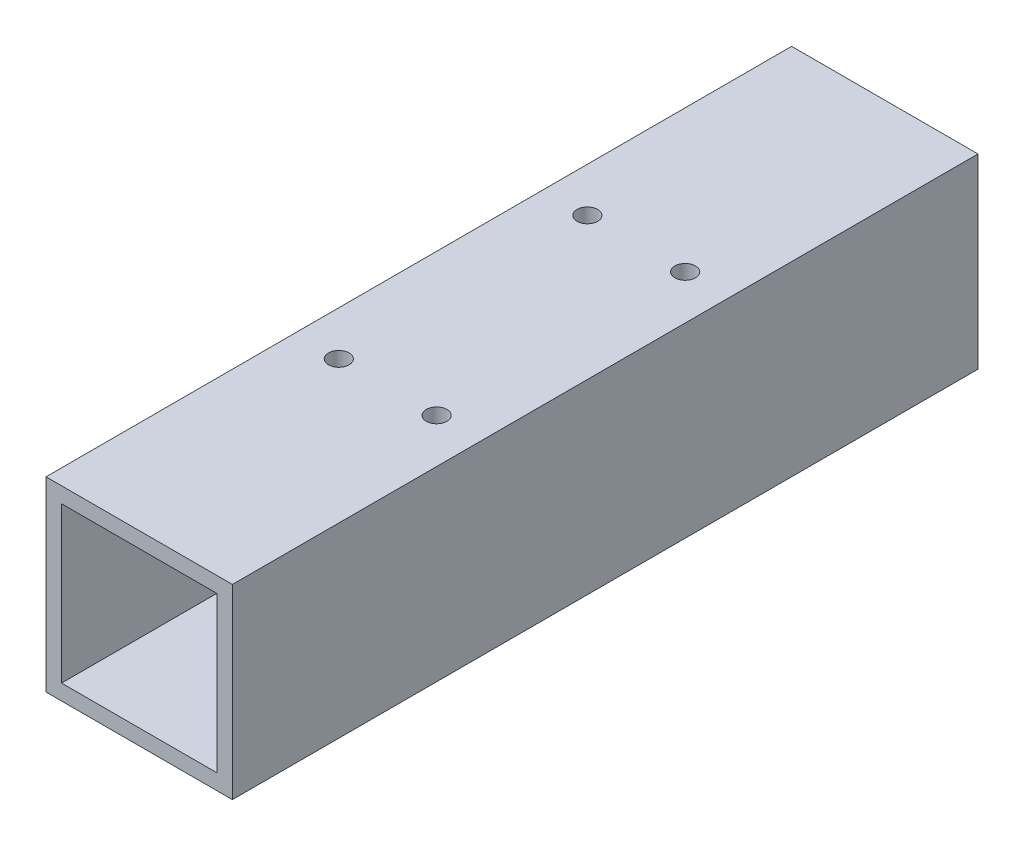
ISO-10303-21;
HEADER;
FILE_DESCRIPTION(('STEP AP214'),'2;1');
FILE_NAME('part.step','',(''),(''),'','','');
FILE_SCHEMA(('AUTOMOTIVE_DESIGN { 1 0 10303 214 1 1 1 1 }'));
ENDSEC;
DATA;
#1=APPLICATION_CONTEXT('core data for automotive mechanical design processes');
#2=APPLICATION_PROTOCOL_DEFINITION('international standard','automotive_design',2000,#1);
#3=PRODUCT_CONTEXT('',#1,'mechanical');
#4=PRODUCT('Part','Part','',(#3));
#5=PRODUCT_RELATED_PRODUCT_CATEGORY('part','',(#4));
#6=PRODUCT_DEFINITION_FORMATION('','',#4);
#7=PRODUCT_DEFINITION_CONTEXT('part definition',#1,'design');
#8=PRODUCT_DEFINITION('design','',#6,#7);
#9=PRODUCT_DEFINITION_SHAPE('','',#8);
#10=(LENGTH_UNIT() NAMED_UNIT(*) SI_UNIT(.MILLI.,.METRE.));
#11=(NAMED_UNIT(*) PLANE_ANGLE_UNIT() SI_UNIT($,.RADIAN.));
#12=(NAMED_UNIT(*) SI_UNIT($,.STERADIAN.) SOLID_ANGLE_UNIT());
#13=UNCERTAINTY_MEASURE_WITH_UNIT(LENGTH_MEASURE(1.E-05),#10,'distance_accuracy_value','');
#14=(GEOMETRIC_REPRESENTATION_CONTEXT(3) GLOBAL_UNCERTAINTY_ASSIGNED_CONTEXT((#13)) GLOBAL_UNIT_ASSIGNED_CONTEXT((#10,
#11,#12)) REPRESENTATION_CONTEXT('',''));
#15=CARTESIAN_POINT('',(0.,0.,0.));
#16=DIRECTION('',(0.,0.,1.));
#17=DIRECTION('',(1.,0.,0.));
#18=AXIS2_PLACEMENT_3D('',#15,#16,#17);
#19=CARTESIAN_POINT('',(-31.75,-31.75,152.4));
#20=DIRECTION('',(0.,1.,0.));
#21=DIRECTION('',(-1.,0.,0.));
#22=AXIS2_PLACEMENT_3D('',#19,#20,#21);
#23=PLANE('',#22);
#24=CARTESIAN_POINT('',(20.,-31.75,-50.8));
#25=DIRECTION('',(0.,1.,0.));
#26=DIRECTION('',(-1.,0.,0.));
#27=AXIS2_PLACEMENT_3D('',#24,#25,#26);
#28=CIRCLE('',#27,6.74623999999999);
#29=CARTESIAN_POINT('',(13.25376,-31.75,-50.8));
#30=VERTEX_POINT('',#29);
#31=EDGE_CURVE('E218',#30,#30,#28,.F.);
#32=ORIENTED_EDGE('',*,*,#31,.T.);
#33=EDGE_LOOP('',(#32));
#34=FACE_BOUND('',#33,.T.);
#35=CARTESIAN_POINT('',(20.,-31.75,50.8));
#36=DIRECTION('',(0.,1.,0.));
#37=DIRECTION('',(-1.,0.,0.));
#38=AXIS2_PLACEMENT_3D('',#35,#36,#37);
#39=CIRCLE('',#38,6.74623999999999);
#40=CARTESIAN_POINT('',(13.25376,-31.75,50.8));
#41=VERTEX_POINT('',#40);
#42=EDGE_CURVE('E206',#41,#41,#39,.F.);
#43=ORIENTED_EDGE('',*,*,#42,.T.);
#44=EDGE_LOOP('',(#43));
#45=FACE_BOUND('',#44,.T.);
#46=DIRECTION('',(0.,0.,-1.));
#47=VECTOR('',#46,1.);
#48=CARTESIAN_POINT('',(31.75,-31.75,152.4));
#49=LINE('',#48,#47);
#50=CARTESIAN_POINT('',(31.75,-31.75,152.4));
#51=VERTEX_POINT('',#50);
#52=CARTESIAN_POINT('',(31.75,-31.75,-152.4));
#53=VERTEX_POINT('',#52);
#54=EDGE_CURVE('E124',#51,#53,#49,.T.);
#55=ORIENTED_EDGE('',*,*,#54,.T.);
#56=DIRECTION('',(1.,0.,0.));
#57=VECTOR('',#56,1.);
#58=CARTESIAN_POINT('',(-31.75,-31.75,-152.4));
#59=LINE('',#58,#57);
#60=CARTESIAN_POINT('',(-31.75,-31.75,-152.4));
#61=VERTEX_POINT('',#60);
#62=EDGE_CURVE('E127',#61,#53,#59,.T.);
#63=ORIENTED_EDGE('',*,*,#62,.F.);
#64=DIRECTION('',(0.,0.,-1.));
#65=VECTOR('',#64,1.);
#66=CARTESIAN_POINT('',(-31.75,-31.75,152.4));
#67=LINE('',#66,#65);
#68=CARTESIAN_POINT('',(-31.75,-31.75,152.4));
#69=VERTEX_POINT('',#68);
#70=EDGE_CURVE('E112',#69,#61,#67,.T.);
#71=ORIENTED_EDGE('',*,*,#70,.F.);
#72=DIRECTION('',(1.,0.,0.));
#73=VECTOR('',#72,1.);
#74=CARTESIAN_POINT('',(-31.75,-31.75,152.4));
#75=LINE('',#74,#73);
#76=EDGE_CURVE('E161',#69,#51,#75,.T.);
#77=ORIENTED_EDGE('',*,*,#76,.T.);
#78=EDGE_LOOP('',(#55,#63,#71,#77));
#79=FACE_BOUND('',#78,.T.);
#80=CARTESIAN_POINT('',(-20.,-31.75,50.8));
#81=DIRECTION('',(0.,1.,0.));
#82=DIRECTION('',(-1.,0.,0.));
#83=AXIS2_PLACEMENT_3D('',#80,#81,#82);
#84=CIRCLE('',#83,6.74623999999999);
#85=CARTESIAN_POINT('',(-26.74624,-31.75,50.8));
#86=VERTEX_POINT('',#85);
#87=EDGE_CURVE('E200',#86,#86,#84,.F.);
#88=ORIENTED_EDGE('',*,*,#87,.T.);
#89=EDGE_LOOP('',(#88));
#90=FACE_BOUND('',#89,.T.);
#91=CARTESIAN_POINT('',(-20.,-31.75,-50.8));
#92=DIRECTION('',(0.,1.,0.));
#93=DIRECTION('',(-1.,0.,0.));
#94=AXIS2_PLACEMENT_3D('',#91,#92,#93);
#95=CIRCLE('',#94,6.74623999999999);
#96=CARTESIAN_POINT('',(-26.74624,-31.75,-50.8));
#97=VERTEX_POINT('',#96);
#98=EDGE_CURVE('E212',#97,#97,#95,.F.);
#99=ORIENTED_EDGE('',*,*,#98,.T.);
#100=EDGE_LOOP('',(#99));
#101=FACE_BOUND('',#100,.T.);
#102=ADVANCED_FACE('F45',(#34,#45,#79,#90,#101),#23,.T.);
#103=CARTESIAN_POINT('',(-38.1,-38.1,152.4));
#104=DIRECTION('',(0.,1.,0.));
#105=DIRECTION('',(0.,0.,1.));
#106=AXIS2_PLACEMENT_3D('',#103,#104,#105);
#107=PLANE('',#106);
#108=CARTESIAN_POINT('',(20.,-38.1,-50.8));
#109=DIRECTION('',(0.,-1.,0.));
#110=DIRECTION('',(0.,0.,-1.));
#111=AXIS2_PLACEMENT_3D('',#108,#109,#110);
#112=CIRCLE('',#111,6.74623999999999);
#113=CARTESIAN_POINT('',(20.,-38.1,-57.54624));
#114=VERTEX_POINT('',#113);
#115=EDGE_CURVE('E221',#114,#114,#112,.T.);
#116=ORIENTED_EDGE('',*,*,#115,.F.);
#117=EDGE_LOOP('',(#116));
#118=FACE_BOUND('',#117,.T.);
#119=CARTESIAN_POINT('',(-20.,-38.1,-50.8));
#120=DIRECTION('',(0.,-1.,0.));
#121=DIRECTION('',(0.,0.,-1.));
#122=AXIS2_PLACEMENT_3D('',#119,#120,#121);
#123=CIRCLE('',#122,6.74623999999999);
#124=CARTESIAN_POINT('',(-20.,-38.1,-57.54624));
#125=VERTEX_POINT('',#124);
#126=EDGE_CURVE('E215',#125,#125,#123,.T.);
#127=ORIENTED_EDGE('',*,*,#126,.F.);
#128=EDGE_LOOP('',(#127));
#129=FACE_BOUND('',#128,.T.);
#130=CARTESIAN_POINT('',(20.,-38.1,50.8));
#131=DIRECTION('',(0.,-1.,0.));
#132=DIRECTION('',(0.,0.,-1.));
#133=AXIS2_PLACEMENT_3D('',#130,#131,#132);
#134=CIRCLE('',#133,6.74623999999999);
#135=CARTESIAN_POINT('',(20.,-38.1,44.05376));
#136=VERTEX_POINT('',#135);
#137=EDGE_CURVE('E209',#136,#136,#134,.T.);
#138=ORIENTED_EDGE('',*,*,#137,.F.);
#139=EDGE_LOOP('',(#138));
#140=FACE_BOUND('',#139,.T.);
#141=CARTESIAN_POINT('',(-20.,-38.1,50.8));
#142=DIRECTION('',(0.,-1.,0.));
#143=DIRECTION('',(0.,0.,-1.));
#144=AXIS2_PLACEMENT_3D('',#141,#142,#143);
#145=CIRCLE('',#144,6.74623999999999);
#146=CARTESIAN_POINT('',(-20.,-38.1,44.05376));
#147=VERTEX_POINT('',#146);
#148=EDGE_CURVE('E203',#147,#147,#145,.T.);
#149=ORIENTED_EDGE('',*,*,#148,.F.);
#150=EDGE_LOOP('',(#149));
#151=FACE_BOUND('',#150,.T.);
#152=DIRECTION('',(0.,0.,-1.));
#153=VECTOR('',#152,1.);
#154=CARTESIAN_POINT('',(-38.1,-38.1,152.4));
#155=LINE('',#154,#153);
#156=CARTESIAN_POINT('',(-38.1,-38.1,152.4));
#157=VERTEX_POINT('',#156);
#158=CARTESIAN_POINT('',(-38.1,-38.1,-152.4));
#159=VERTEX_POINT('',#158);
#160=EDGE_CURVE('E11',#157,#159,#155,.T.);
#161=ORIENTED_EDGE('',*,*,#160,.T.);
#162=DIRECTION('',(1.,0.,0.));
#163=VECTOR('',#162,1.);
#164=CARTESIAN_POINT('',(-38.1,-38.1,-152.4));
#165=LINE('',#164,#163);
#166=CARTESIAN_POINT('',(38.1,-38.1,-152.4));
#167=VERTEX_POINT('',#166);
#168=EDGE_CURVE('E151',#159,#167,#165,.T.);
#169=ORIENTED_EDGE('',*,*,#168,.T.);
#170=DIRECTION('',(0.,0.,-1.));
#171=VECTOR('',#170,1.);
#172=CARTESIAN_POINT('',(38.1,-38.1,152.4));
#173=LINE('',#172,#171);
#174=CARTESIAN_POINT('',(38.1,-38.1,152.4));
#175=VERTEX_POINT('',#174);
#176=EDGE_CURVE('E54',#175,#167,#173,.T.);
#177=ORIENTED_EDGE('',*,*,#176,.F.);
#178=DIRECTION('',(1.,0.,0.));
#179=VECTOR('',#178,1.);
#180=CARTESIAN_POINT('',(-38.1,-38.1,152.4));
#181=LINE('',#180,#179);
#182=EDGE_CURVE('E172',#157,#175,#181,.T.);
#183=ORIENTED_EDGE('',*,*,#182,.F.);
#184=EDGE_LOOP('',(#161,#169,#177,#183));
#185=FACE_BOUND('',#184,.T.);
#186=ADVANCED_FACE('F227',(#118,#129,#140,#151,#185),#107,.F.);
#187=CARTESIAN_POINT('',(0.,0.,152.4));
#188=DIRECTION('',(0.,0.,1.));
#189=DIRECTION('',(1.,0.,0.));
#190=AXIS2_PLACEMENT_3D('',#187,#188,#189);
#191=PLANE('',#190);
#192=DIRECTION('',(0.,-1.,0.));
#193=VECTOR('',#192,1.);
#194=CARTESIAN_POINT('',(-38.1,38.1,152.4));
#195=LINE('',#194,#193);
#196=CARTESIAN_POINT('',(-38.1,38.1,152.4));
#197=VERTEX_POINT('',#196);
#198=EDGE_CURVE('E123',#197,#157,#195,.T.);
#199=ORIENTED_EDGE('',*,*,#198,.T.);
#200=ORIENTED_EDGE('',*,*,#182,.T.);
#201=DIRECTION('',(0.,1.,0.));
#202=VECTOR('',#201,1.);
#203=CARTESIAN_POINT('',(38.1,-38.1,152.4));
#204=LINE('',#203,#202);
#205=CARTESIAN_POINT('',(38.1,38.1,152.4));
#206=VERTEX_POINT('',#205);
#207=EDGE_CURVE('E174',#175,#206,#204,.T.);
#208=ORIENTED_EDGE('',*,*,#207,.T.);
#209=DIRECTION('',(-1.,0.,0.));
#210=VECTOR('',#209,1.);
#211=CARTESIAN_POINT('',(38.1,38.1,152.4));
#212=LINE('',#211,#210);
#213=EDGE_CURVE('E70',#206,#197,#212,.T.);
#214=ORIENTED_EDGE('',*,*,#213,.T.);
#215=EDGE_LOOP('',(#199,#200,#208,#214));
#216=FACE_BOUND('',#215,.T.);
#217=ORIENTED_EDGE('',*,*,#76,.F.);
#218=DIRECTION('',(0.,-1.,0.));
#219=VECTOR('',#218,1.);
#220=CARTESIAN_POINT('',(-31.75,31.75,152.4));
#221=LINE('',#220,#219);
#222=CARTESIAN_POINT('',(-31.75,31.75,152.4));
#223=VERTEX_POINT('',#222);
#224=EDGE_CURVE('E120',#223,#69,#221,.T.);
#225=ORIENTED_EDGE('',*,*,#224,.F.);
#226=DIRECTION('',(-1.,0.,0.));
#227=VECTOR('',#226,1.);
#228=CARTESIAN_POINT('',(31.75,31.75,152.4));
#229=LINE('',#228,#227);
#230=CARTESIAN_POINT('',(31.75,31.75,152.4));
#231=VERTEX_POINT('',#230);
#232=EDGE_CURVE('E165',#231,#223,#229,.T.);
#233=ORIENTED_EDGE('',*,*,#232,.F.);
#234=DIRECTION('',(0.,1.,0.));
#235=VECTOR('',#234,1.);
#236=CARTESIAN_POINT('',(31.75,-31.75,152.4));
#237=LINE('',#236,#235);
#238=EDGE_CURVE('E163',#51,#231,#237,.T.);
#239=ORIENTED_EDGE('',*,*,#238,.F.);
#240=EDGE_LOOP('',(#217,#225,#233,#239));
#241=FACE_BOUND('',#240,.T.);
#242=ADVANCED_FACE('F230',(#216,#241),#191,.T.);
#243=CARTESIAN_POINT('',(-38.1,38.1,152.4));
#244=DIRECTION('',(1.,0.,0.));
#245=DIRECTION('',(0.,0.,-1.));
#246=AXIS2_PLACEMENT_3D('',#243,#244,#245);
#247=PLANE('',#246);
#248=DIRECTION('',(0.,0.,-1.));
#249=VECTOR('',#248,1.);
#250=CARTESIAN_POINT('',(-38.1,38.1,152.4));
#251=LINE('',#250,#249);
#252=CARTESIAN_POINT('',(-38.1,38.1,-152.4));
#253=VERTEX_POINT('',#252);
#254=EDGE_CURVE('E177',#197,#253,#251,.T.);
#255=ORIENTED_EDGE('',*,*,#254,.T.);
#256=DIRECTION('',(0.,-1.,0.));
#257=VECTOR('',#256,1.);
#258=CARTESIAN_POINT('',(-38.1,38.1,-152.4));
#259=LINE('',#258,#257);
#260=EDGE_CURVE('E148',#253,#159,#259,.T.);
#261=ORIENTED_EDGE('',*,*,#260,.T.);
#262=ORIENTED_EDGE('',*,*,#160,.F.);
#263=ORIENTED_EDGE('',*,*,#198,.F.);
#264=EDGE_LOOP('',(#255,#261,#262,#263));
#265=FACE_BOUND('',#264,.T.);
#266=ADVANCED_FACE('F47',(#265),#247,.F.);
#267=CARTESIAN_POINT('',(38.1,-38.1,152.4));
#268=DIRECTION('',(-1.,0.,0.));
#269=DIRECTION('',(0.,0.,1.));
#270=AXIS2_PLACEMENT_3D('',#267,#268,#269);
#271=PLANE('',#270);
#272=ORIENTED_EDGE('',*,*,#176,.T.);
#273=DIRECTION('',(0.,1.,0.));
#274=VECTOR('',#273,1.);
#275=CARTESIAN_POINT('',(38.1,-38.1,-152.4));
#276=LINE('',#275,#274);
#277=CARTESIAN_POINT('',(38.1,38.1,-152.4));
#278=VERTEX_POINT('',#277);
#279=EDGE_CURVE('E154',#167,#278,#276,.T.);
#280=ORIENTED_EDGE('',*,*,#279,.T.);
#281=DIRECTION('',(0.,0.,-1.));
#282=VECTOR('',#281,1.);
#283=CARTESIAN_POINT('',(38.1,38.1,152.4));
#284=LINE('',#283,#282);
#285=EDGE_CURVE('E179',#206,#278,#284,.T.);
#286=ORIENTED_EDGE('',*,*,#285,.F.);
#287=ORIENTED_EDGE('',*,*,#207,.F.);
#288=EDGE_LOOP('',(#272,#280,#286,#287));
#289=FACE_BOUND('',#288,.T.);
#290=ADVANCED_FACE('F250',(#289),#271,.F.);
#291=CARTESIAN_POINT('',(38.1,38.1,152.4));
#292=DIRECTION('',(0.,-1.,0.));
#293=DIRECTION('',(1.,0.,0.));
#294=AXIS2_PLACEMENT_3D('',#291,#292,#293);
#295=PLANE('',#294);
#296=CARTESIAN_POINT('',(-20.,38.1,-50.8));
#297=DIRECTION('',(0.,-1.,0.));
#298=DIRECTION('',(0.,0.,-1.));
#299=AXIS2_PLACEMENT_3D('',#296,#297,#298);
#300=CIRCLE('',#299,4.21639999999999);
#301=CARTESIAN_POINT('',(-20.,38.1,-55.0164));
#302=VERTEX_POINT('',#301);
#303=EDGE_CURVE('E196',#302,#302,#300,.T.);
#304=ORIENTED_EDGE('',*,*,#303,.T.);
#305=EDGE_LOOP('',(#304));
#306=FACE_BOUND('',#305,.T.);
#307=CARTESIAN_POINT('',(20.,38.1,50.8));
#308=DIRECTION('',(0.,-1.,0.));
#309=DIRECTION('',(0.,0.,-1.));
#310=AXIS2_PLACEMENT_3D('',#307,#308,#309);
#311=CIRCLE('',#310,4.21639999999999);
#312=CARTESIAN_POINT('',(20.,38.1,46.5836));
#313=VERTEX_POINT('',#312);
#314=EDGE_CURVE('E187',#313,#313,#311,.T.);
#315=ORIENTED_EDGE('',*,*,#314,.T.);
#316=EDGE_LOOP('',(#315));
#317=FACE_BOUND('',#316,.T.);
#318=CARTESIAN_POINT('',(20.,38.1,-50.8));
#319=DIRECTION('',(0.,-1.,0.));
#320=DIRECTION('',(0.,0.,-1.));
#321=AXIS2_PLACEMENT_3D('',#318,#319,#320);
#322=CIRCLE('',#321,4.21639999999999);
#323=CARTESIAN_POINT('',(20.,38.1,-55.0164));
#324=VERTEX_POINT('',#323);
#325=EDGE_CURVE('E184',#324,#324,#322,.T.);
#326=ORIENTED_EDGE('',*,*,#325,.T.);
#327=EDGE_LOOP('',(#326));
#328=FACE_BOUND('',#327,.T.);
#329=CARTESIAN_POINT('',(-20.,38.1,50.8));
#330=DIRECTION('',(0.,-1.,0.));
#331=DIRECTION('',(0.,0.,-1.));
#332=AXIS2_PLACEMENT_3D('',#329,#330,#331);
#333=CIRCLE('',#332,4.21639999999999);
#334=CARTESIAN_POINT('',(-20.,38.1,46.5836));
#335=VERTEX_POINT('',#334);
#336=EDGE_CURVE('E141',#335,#335,#333,.T.);
#337=ORIENTED_EDGE('',*,*,#336,.T.);
#338=EDGE_LOOP('',(#337));
#339=FACE_BOUND('',#338,.T.);
#340=ORIENTED_EDGE('',*,*,#285,.T.);
#341=DIRECTION('',(-1.,0.,0.));
#342=VECTOR('',#341,1.);
#343=CARTESIAN_POINT('',(38.1,38.1,-152.4));
#344=LINE('',#343,#342);
#345=EDGE_CURVE('E157',#278,#253,#344,.T.);
#346=ORIENTED_EDGE('',*,*,#345,.T.);
#347=ORIENTED_EDGE('',*,*,#254,.F.);
#348=ORIENTED_EDGE('',*,*,#213,.F.);
#349=EDGE_LOOP('',(#340,#346,#347,#348));
#350=FACE_BOUND('',#349,.T.);
#351=ADVANCED_FACE('F246',(#306,#317,#328,#339,#350),#295,.F.);
#352=CARTESIAN_POINT('',(-31.75,31.75,152.4));
#353=DIRECTION('',(1.,0.,0.));
#354=DIRECTION('',(0.,1.,0.));
#355=AXIS2_PLACEMENT_3D('',#352,#353,#354);
#356=PLANE('',#355);
#357=ORIENTED_EDGE('',*,*,#70,.T.);
#358=DIRECTION('',(0.,-1.,0.));
#359=VECTOR('',#358,1.);
#360=CARTESIAN_POINT('',(-31.75,31.75,-152.4));
#361=LINE('',#360,#359);
#362=CARTESIAN_POINT('',(-31.75,31.75,-152.4));
#363=VERTEX_POINT('',#362);
#364=EDGE_CURVE('E117',#363,#61,#361,.T.);
#365=ORIENTED_EDGE('',*,*,#364,.F.);
#366=DIRECTION('',(0.,0.,-1.));
#367=VECTOR('',#366,1.);
#368=CARTESIAN_POINT('',(-31.75,31.75,152.4));
#369=LINE('',#368,#367);
#370=EDGE_CURVE('E167',#223,#363,#369,.T.);
#371=ORIENTED_EDGE('',*,*,#370,.F.);
#372=ORIENTED_EDGE('',*,*,#224,.T.);
#373=EDGE_LOOP('',(#357,#365,#371,#372));
#374=FACE_BOUND('',#373,.T.);
#375=ADVANCED_FACE('F114',(#374),#356,.T.);
#376=CARTESIAN_POINT('',(31.75,-31.75,152.4));
#377=DIRECTION('',(-1.,0.,0.));
#378=DIRECTION('',(0.,-1.,0.));
#379=AXIS2_PLACEMENT_3D('',#376,#377,#378);
#380=PLANE('',#379);
#381=DIRECTION('',(0.,0.,-1.));
#382=VECTOR('',#381,1.);
#383=CARTESIAN_POINT('',(31.75,31.75,152.4));
#384=LINE('',#383,#382);
#385=CARTESIAN_POINT('',(31.75,31.75,-152.4));
#386=VERTEX_POINT('',#385);
#387=EDGE_CURVE('E62',#231,#386,#384,.T.);
#388=ORIENTED_EDGE('',*,*,#387,.T.);
#389=DIRECTION('',(0.,1.,0.));
#390=VECTOR('',#389,1.);
#391=CARTESIAN_POINT('',(31.75,-31.75,-152.4));
#392=LINE('',#391,#390);
#393=EDGE_CURVE('E133',#53,#386,#392,.T.);
#394=ORIENTED_EDGE('',*,*,#393,.F.);
#395=ORIENTED_EDGE('',*,*,#54,.F.);
#396=ORIENTED_EDGE('',*,*,#238,.T.);
#397=EDGE_LOOP('',(#388,#394,#395,#396));
#398=FACE_BOUND('',#397,.T.);
#399=ADVANCED_FACE('F257',(#398),#380,.T.);
#400=CARTESIAN_POINT('',(31.75,31.75,152.4));
#401=DIRECTION('',(0.,-1.,0.));
#402=DIRECTION('',(0.,0.,-1.));
#403=AXIS2_PLACEMENT_3D('',#400,#401,#402);
#404=PLANE('',#403);
#405=CARTESIAN_POINT('',(-20.,31.75,-50.8));
#406=DIRECTION('',(0.,-1.,0.));
#407=DIRECTION('',(0.,0.,-1.));
#408=AXIS2_PLACEMENT_3D('',#405,#406,#407);
#409=CIRCLE('',#408,4.21639999999999);
#410=CARTESIAN_POINT('',(-20.,31.75,-55.0164));
#411=VERTEX_POINT('',#410);
#412=EDGE_CURVE('E49',#411,#411,#409,.T.);
#413=ORIENTED_EDGE('',*,*,#412,.F.);
#414=EDGE_LOOP('',(#413));
#415=FACE_BOUND('',#414,.T.);
#416=CARTESIAN_POINT('',(20.,31.75,50.8));
#417=DIRECTION('',(0.,-1.,0.));
#418=DIRECTION('',(0.,0.,-1.));
#419=AXIS2_PLACEMENT_3D('',#416,#417,#418);
#420=CIRCLE('',#419,4.21639999999999);
#421=CARTESIAN_POINT('',(20.,31.75,46.5836));
#422=VERTEX_POINT('',#421);
#423=EDGE_CURVE('E185',#422,#422,#420,.T.);
#424=ORIENTED_EDGE('',*,*,#423,.F.);
#425=EDGE_LOOP('',(#424));
#426=FACE_BOUND('',#425,.T.);
#427=CARTESIAN_POINT('',(20.,31.75,-50.8));
#428=DIRECTION('',(0.,-1.,0.));
#429=DIRECTION('',(0.,0.,-1.));
#430=AXIS2_PLACEMENT_3D('',#427,#428,#429);
#431=CIRCLE('',#430,4.21639999999999);
#432=CARTESIAN_POINT('',(20.,31.75,-55.0164));
#433=VERTEX_POINT('',#432);
#434=EDGE_CURVE('E182',#433,#433,#431,.T.);
#435=ORIENTED_EDGE('',*,*,#434,.F.);
#436=EDGE_LOOP('',(#435));
#437=FACE_BOUND('',#436,.T.);
#438=CARTESIAN_POINT('',(-20.,31.75,50.8));
#439=DIRECTION('',(0.,-1.,0.));
#440=DIRECTION('',(0.,0.,-1.));
#441=AXIS2_PLACEMENT_3D('',#438,#439,#440);
#442=CIRCLE('',#441,4.21639999999999);
#443=CARTESIAN_POINT('',(-20.,31.75,46.5836));
#444=VERTEX_POINT('',#443);
#445=EDGE_CURVE('E138',#444,#444,#442,.T.);
#446=ORIENTED_EDGE('',*,*,#445,.F.);
#447=EDGE_LOOP('',(#446));
#448=FACE_BOUND('',#447,.T.);
#449=ORIENTED_EDGE('',*,*,#370,.T.);
#450=DIRECTION('',(-1.,0.,0.));
#451=VECTOR('',#450,1.);
#452=CARTESIAN_POINT('',(31.75,31.75,-152.4));
#453=LINE('',#452,#451);
#454=EDGE_CURVE('E137',#386,#363,#453,.T.);
#455=ORIENTED_EDGE('',*,*,#454,.F.);
#456=ORIENTED_EDGE('',*,*,#387,.F.);
#457=ORIENTED_EDGE('',*,*,#232,.T.);
#458=EDGE_LOOP('',(#449,#455,#456,#457));
#459=FACE_BOUND('',#458,.T.);
#460=ADVANCED_FACE('F258',(#415,#426,#437,#448,#459),#404,.T.);
#461=CARTESIAN_POINT('',(0.,0.,-152.4));
#462=DIRECTION('',(0.,0.,1.));
#463=DIRECTION('',(1.,0.,0.));
#464=AXIS2_PLACEMENT_3D('',#461,#462,#463);
#465=PLANE('',#464);
#466=ORIENTED_EDGE('',*,*,#454,.T.);
#467=ORIENTED_EDGE('',*,*,#364,.T.);
#468=ORIENTED_EDGE('',*,*,#62,.T.);
#469=ORIENTED_EDGE('',*,*,#393,.T.);
#470=EDGE_LOOP('',(#466,#467,#468,#469));
#471=FACE_BOUND('',#470,.T.);
#472=ORIENTED_EDGE('',*,*,#260,.F.);
#473=ORIENTED_EDGE('',*,*,#345,.F.);
#474=ORIENTED_EDGE('',*,*,#279,.F.);
#475=ORIENTED_EDGE('',*,*,#168,.F.);
#476=EDGE_LOOP('',(#472,#473,#474,#475));
#477=FACE_BOUND('',#476,.T.);
#478=ADVANCED_FACE('F135',(#471,#477),#465,.F.);
#479=CARTESIAN_POINT('',(-20.,-38.1,50.8));
#480=DIRECTION('',(0.,-1.,0.));
#481=DIRECTION('',(0.,0.,-1.));
#482=AXIS2_PLACEMENT_3D('',#479,#480,#481);
#483=CYLINDRICAL_SURFACE('',#482,4.21639999999999);
#484=ORIENTED_EDGE('',*,*,#445,.T.);
#485=EDGE_LOOP('',(#484));
#486=FACE_BOUND('',#485,.T.);
#487=ORIENTED_EDGE('',*,*,#336,.F.);
#488=EDGE_LOOP('',(#487));
#489=FACE_BOUND('',#488,.T.);
#490=ADVANCED_FACE('F266',(#486,#489),#483,.F.);
#491=CARTESIAN_POINT('',(20.,-38.1,-50.8));
#492=DIRECTION('',(0.,-1.,0.));
#493=DIRECTION('',(0.,0.,-1.));
#494=AXIS2_PLACEMENT_3D('',#491,#492,#493);
#495=CYLINDRICAL_SURFACE('',#494,4.21639999999999);
#496=ORIENTED_EDGE('',*,*,#434,.T.);
#497=EDGE_LOOP('',(#496));
#498=FACE_BOUND('',#497,.T.);
#499=ORIENTED_EDGE('',*,*,#325,.F.);
#500=EDGE_LOOP('',(#499));
#501=FACE_BOUND('',#500,.T.);
#502=ADVANCED_FACE('F372',(#498,#501),#495,.F.);
#503=CARTESIAN_POINT('',(20.,-38.1,50.8));
#504=DIRECTION('',(0.,-1.,0.));
#505=DIRECTION('',(0.,0.,-1.));
#506=AXIS2_PLACEMENT_3D('',#503,#504,#505);
#507=CYLINDRICAL_SURFACE('',#506,4.21639999999999);
#508=ORIENTED_EDGE('',*,*,#423,.T.);
#509=EDGE_LOOP('',(#508));
#510=FACE_BOUND('',#509,.T.);
#511=ORIENTED_EDGE('',*,*,#314,.F.);
#512=EDGE_LOOP('',(#511));
#513=FACE_BOUND('',#512,.T.);
#514=ADVANCED_FACE('F363',(#510,#513),#507,.F.);
#515=CARTESIAN_POINT('',(-20.,-38.1,-50.8));
#516=DIRECTION('',(0.,-1.,0.));
#517=DIRECTION('',(0.,0.,-1.));
#518=AXIS2_PLACEMENT_3D('',#515,#516,#517);
#519=CYLINDRICAL_SURFACE('',#518,4.21639999999999);
#520=ORIENTED_EDGE('',*,*,#412,.T.);
#521=EDGE_LOOP('',(#520));
#522=FACE_BOUND('',#521,.T.);
#523=ORIENTED_EDGE('',*,*,#303,.F.);
#524=EDGE_LOOP('',(#523));
#525=FACE_BOUND('',#524,.T.);
#526=ADVANCED_FACE('F313',(#522,#525),#519,.F.);
#527=CARTESIAN_POINT('',(-20.,-38.1,50.8));
#528=DIRECTION('',(0.,-1.,0.));
#529=DIRECTION('',(0.,0.,-1.));
#530=AXIS2_PLACEMENT_3D('',#527,#528,#529);
#531=CYLINDRICAL_SURFACE('',#530,6.74623999999999);
#532=ORIENTED_EDGE('',*,*,#87,.F.);
#533=EDGE_LOOP('',(#532));
#534=FACE_BOUND('',#533,.T.);
#535=ORIENTED_EDGE('',*,*,#148,.T.);
#536=EDGE_LOOP('',(#535));
#537=FACE_BOUND('',#536,.T.);
#538=ADVANCED_FACE('F307',(#534,#537),#531,.F.);
#539=CARTESIAN_POINT('',(20.,-38.1,50.8));
#540=DIRECTION('',(0.,-1.,0.));
#541=DIRECTION('',(0.,0.,-1.));
#542=AXIS2_PLACEMENT_3D('',#539,#540,#541);
#543=CYLINDRICAL_SURFACE('',#542,6.74623999999999);
#544=ORIENTED_EDGE('',*,*,#42,.F.);
#545=EDGE_LOOP('',(#544));
#546=FACE_BOUND('',#545,.T.);
#547=ORIENTED_EDGE('',*,*,#137,.T.);
#548=EDGE_LOOP('',(#547));
#549=FACE_BOUND('',#548,.T.);
#550=ADVANCED_FACE('F312',(#546,#549),#543,.F.);
#551=CARTESIAN_POINT('',(-20.,-38.1,-50.8));
#552=DIRECTION('',(0.,-1.,0.));
#553=DIRECTION('',(0.,0.,-1.));
#554=AXIS2_PLACEMENT_3D('',#551,#552,#553);
#555=CYLINDRICAL_SURFACE('',#554,6.74623999999999);
#556=ORIENTED_EDGE('',*,*,#98,.F.);
#557=EDGE_LOOP('',(#556));
#558=FACE_BOUND('',#557,.T.);
#559=ORIENTED_EDGE('',*,*,#126,.T.);
#560=EDGE_LOOP('',(#559));
#561=FACE_BOUND('',#560,.T.);
#562=ADVANCED_FACE('F326',(#558,#561),#555,.F.);
#563=CARTESIAN_POINT('',(20.,-38.1,-50.8));
#564=DIRECTION('',(0.,-1.,0.));
#565=DIRECTION('',(0.,0.,-1.));
#566=AXIS2_PLACEMENT_3D('',#563,#564,#565);
#567=CYLINDRICAL_SURFACE('',#566,6.74623999999999);
#568=ORIENTED_EDGE('',*,*,#31,.F.);
#569=EDGE_LOOP('',(#568));
#570=FACE_BOUND('',#569,.T.);
#571=ORIENTED_EDGE('',*,*,#115,.T.);
#572=EDGE_LOOP('',(#571));
#573=FACE_BOUND('',#572,.T.);
#574=ADVANCED_FACE('F225',(#570,#573),#567,.F.);
#575=CLOSED_SHELL('',(#102,#186,#242,#266,#290,#351,#375,#399,#460,#478,#490,#502,#514,#526,
#538,#550,#562,#574));
#576=MANIFOLD_SOLID_BREP('B2',#575);
#577=ADVANCED_BREP_SHAPE_REPRESENTATION('',(#18,#576),#14);
#578=SHAPE_DEFINITION_REPRESENTATION(#9,#577);
ENDSEC;
END-ISO-10303-21;
